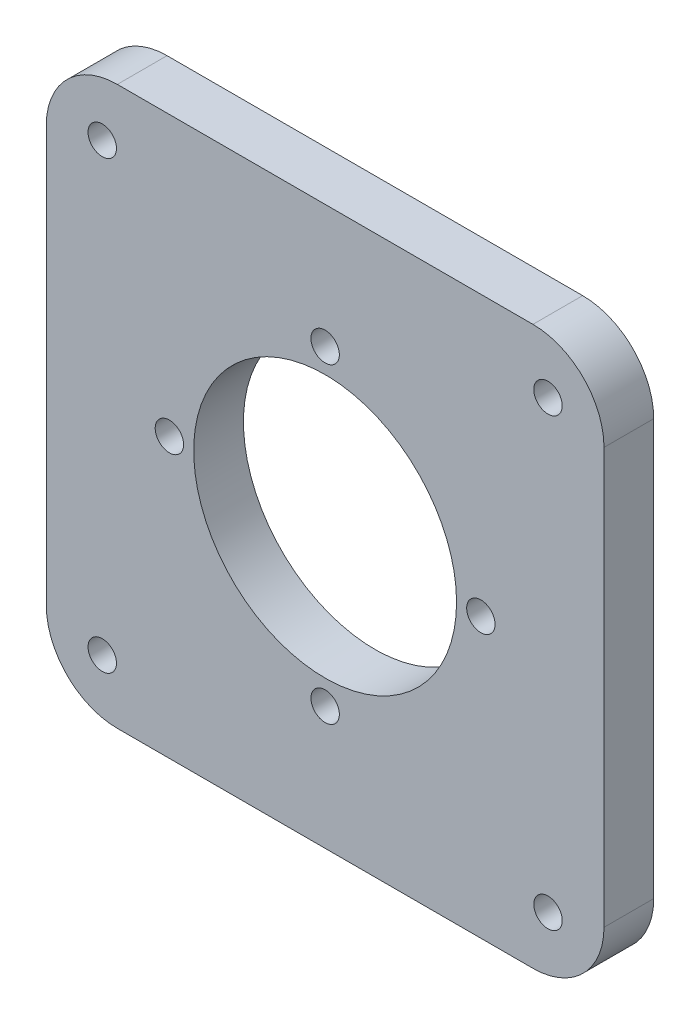
ISO-10303-21;
HEADER;
FILE_DESCRIPTION(('STEP AP214'),'2;1');
FILE_NAME('part.step','',(''),(''),'','','');
FILE_SCHEMA(('AUTOMOTIVE_DESIGN { 1 0 10303 214 1 1 1 1 }'));
ENDSEC;
DATA;
#1=APPLICATION_CONTEXT('core data for automotive mechanical design processes');
#2=APPLICATION_PROTOCOL_DEFINITION('international standard','automotive_design',2000,#1);
#3=PRODUCT_CONTEXT('',#1,'mechanical');
#4=PRODUCT('Part','Part','',(#3));
#5=PRODUCT_RELATED_PRODUCT_CATEGORY('part','',(#4));
#6=PRODUCT_DEFINITION_FORMATION('','',#4);
#7=PRODUCT_DEFINITION_CONTEXT('part definition',#1,'design');
#8=PRODUCT_DEFINITION('design','',#6,#7);
#9=PRODUCT_DEFINITION_SHAPE('','',#8);
#10=(LENGTH_UNIT() NAMED_UNIT(*) SI_UNIT(.MILLI.,.METRE.));
#11=(NAMED_UNIT(*) PLANE_ANGLE_UNIT() SI_UNIT($,.RADIAN.));
#12=(NAMED_UNIT(*) SI_UNIT($,.STERADIAN.) SOLID_ANGLE_UNIT());
#13=UNCERTAINTY_MEASURE_WITH_UNIT(LENGTH_MEASURE(1.E-05),#10,'distance_accuracy_value','');
#14=(GEOMETRIC_REPRESENTATION_CONTEXT(3) GLOBAL_UNCERTAINTY_ASSIGNED_CONTEXT((#13)) GLOBAL_UNIT_ASSIGNED_CONTEXT((#10,
#11,#12)) REPRESENTATION_CONTEXT('',''));
#15=CARTESIAN_POINT('',(0.,0.,0.));
#16=DIRECTION('',(0.,0.,1.));
#17=DIRECTION('',(1.,0.,0.));
#18=AXIS2_PLACEMENT_3D('',#15,#16,#17);
#19=CARTESIAN_POINT('',(39.25,-39.25,3.5));
#20=DIRECTION('',(-1.,0.,0.));
#21=DIRECTION('',(0.,0.,1.));
#22=AXIS2_PLACEMENT_3D('',#19,#20,#21);
#23=PLANE('',#22);
#24=DIRECTION('',(0.,1.,0.));
#25=VECTOR('',#24,1.);
#26=CARTESIAN_POINT('',(39.25,-39.25,3.5));
#27=LINE('',#26,#25);
#28=CARTESIAN_POINT('',(39.25,-29.25,3.5));
#29=VERTEX_POINT('',#28);
#30=CARTESIAN_POINT('',(39.25,29.25,3.5));
#31=VERTEX_POINT('',#30);
#32=EDGE_CURVE('E139',#29,#31,#27,.T.);
#33=ORIENTED_EDGE('',*,*,#32,.F.);
#34=DIRECTION('',(0.,0.,-1.));
#35=VECTOR('',#34,1.);
#36=CARTESIAN_POINT('',(39.25,-29.25,3.5));
#37=LINE('',#36,#35);
#38=CARTESIAN_POINT('',(39.25,-29.25,-3.5));
#39=VERTEX_POINT('',#38);
#40=EDGE_CURVE('E178',#29,#39,#37,.T.);
#41=ORIENTED_EDGE('',*,*,#40,.T.);
#42=DIRECTION('',(0.,1.,0.));
#43=VECTOR('',#42,1.);
#44=CARTESIAN_POINT('',(39.25,-39.25,-3.5));
#45=LINE('',#44,#43);
#46=CARTESIAN_POINT('',(39.25,29.25,-3.5));
#47=VERTEX_POINT('',#46);
#48=EDGE_CURVE('E193',#39,#47,#45,.T.);
#49=ORIENTED_EDGE('',*,*,#48,.T.);
#50=DIRECTION('',(0.,0.,-1.));
#51=VECTOR('',#50,1.);
#52=CARTESIAN_POINT('',(39.25,29.25,3.5));
#53=LINE('',#52,#51);
#54=EDGE_CURVE('E175',#47,#31,#53,.F.);
#55=ORIENTED_EDGE('',*,*,#54,.T.);
#56=EDGE_LOOP('',(#33,#41,#49,#55));
#57=FACE_BOUND('',#56,.T.);
#58=ADVANCED_FACE('F43',(#57),#23,.F.);
#59=CARTESIAN_POINT('',(-39.25,39.25,3.5));
#60=DIRECTION('',(0.,-1.,0.));
#61=DIRECTION('',(0.,0.,-1.));
#62=AXIS2_PLACEMENT_3D('',#59,#60,#61);
#63=PLANE('',#62);
#64=DIRECTION('',(-1.,0.,0.));
#65=VECTOR('',#64,1.);
#66=CARTESIAN_POINT('',(-39.25,39.25,3.5));
#67=LINE('',#66,#65);
#68=CARTESIAN_POINT('',(29.25,39.25,3.5));
#69=VERTEX_POINT('',#68);
#70=CARTESIAN_POINT('',(-29.25,39.25,3.5));
#71=VERTEX_POINT('',#70);
#72=EDGE_CURVE('E144',#69,#71,#67,.T.);
#73=ORIENTED_EDGE('',*,*,#72,.F.);
#74=DIRECTION('',(0.,0.,-1.));
#75=VECTOR('',#74,1.);
#76=CARTESIAN_POINT('',(29.25,39.25,3.5));
#77=LINE('',#76,#75);
#78=CARTESIAN_POINT('',(29.25,39.25,-3.5));
#79=VERTEX_POINT('',#78);
#80=EDGE_CURVE('E11',#69,#79,#77,.T.);
#81=ORIENTED_EDGE('',*,*,#80,.T.);
#82=DIRECTION('',(-1.,0.,0.));
#83=VECTOR('',#82,1.);
#84=CARTESIAN_POINT('',(-39.25,39.25,-3.5));
#85=LINE('',#84,#83);
#86=CARTESIAN_POINT('',(-29.25,39.25,-3.5));
#87=VERTEX_POINT('',#86);
#88=EDGE_CURVE('E146',#79,#87,#85,.T.);
#89=ORIENTED_EDGE('',*,*,#88,.T.);
#90=DIRECTION('',(0.,0.,-1.));
#91=VECTOR('',#90,1.);
#92=CARTESIAN_POINT('',(-29.25,39.25,3.5));
#93=LINE('',#92,#91);
#94=EDGE_CURVE('E52',#87,#71,#93,.F.);
#95=ORIENTED_EDGE('',*,*,#94,.T.);
#96=EDGE_LOOP('',(#73,#81,#89,#95));
#97=FACE_BOUND('',#96,.T.);
#98=ADVANCED_FACE('F199',(#97),#63,.F.);
#99=CARTESIAN_POINT('',(-39.25,-39.25,3.5));
#100=DIRECTION('',(1.,0.,0.));
#101=DIRECTION('',(0.,0.,-1.));
#102=AXIS2_PLACEMENT_3D('',#99,#100,#101);
#103=PLANE('',#102);
#104=DIRECTION('',(0.,-1.,0.));
#105=VECTOR('',#104,1.);
#106=CARTESIAN_POINT('',(-39.25,-39.25,-3.5));
#107=LINE('',#106,#105);
#108=CARTESIAN_POINT('',(-39.25,29.25,-3.5));
#109=VERTEX_POINT('',#108);
#110=CARTESIAN_POINT('',(-39.25,-29.25,-3.5));
#111=VERTEX_POINT('',#110);
#112=EDGE_CURVE('E140',#109,#111,#107,.T.);
#113=ORIENTED_EDGE('',*,*,#112,.T.);
#114=DIRECTION('',(0.,0.,-1.));
#115=VECTOR('',#114,1.);
#116=CARTESIAN_POINT('',(-39.25,-29.25,3.5));
#117=LINE('',#116,#115);
#118=CARTESIAN_POINT('',(-39.25,-29.25,3.5));
#119=VERTEX_POINT('',#118);
#120=EDGE_CURVE('E115',#111,#119,#117,.F.);
#121=ORIENTED_EDGE('',*,*,#120,.T.);
#122=DIRECTION('',(0.,-1.,0.));
#123=VECTOR('',#122,1.);
#124=CARTESIAN_POINT('',(-39.25,-39.25,3.5));
#125=LINE('',#124,#123);
#126=CARTESIAN_POINT('',(-39.25,29.25,3.5));
#127=VERTEX_POINT('',#126);
#128=EDGE_CURVE('E184',#127,#119,#125,.T.);
#129=ORIENTED_EDGE('',*,*,#128,.F.);
#130=DIRECTION('',(0.,0.,-1.));
#131=VECTOR('',#130,1.);
#132=CARTESIAN_POINT('',(-39.25,29.25,3.5));
#133=LINE('',#132,#131);
#134=EDGE_CURVE('E121',#127,#109,#133,.T.);
#135=ORIENTED_EDGE('',*,*,#134,.T.);
#136=EDGE_LOOP('',(#113,#121,#129,#135));
#137=FACE_BOUND('',#136,.T.);
#138=ADVANCED_FACE('F206',(#137),#103,.F.);
#139=CARTESIAN_POINT('',(-39.25,-39.25,3.5));
#140=DIRECTION('',(0.,1.,0.));
#141=DIRECTION('',(0.,0.,1.));
#142=AXIS2_PLACEMENT_3D('',#139,#140,#141);
#143=PLANE('',#142);
#144=DIRECTION('',(1.,0.,0.));
#145=VECTOR('',#144,1.);
#146=CARTESIAN_POINT('',(-39.25,-39.25,3.5));
#147=LINE('',#146,#145);
#148=CARTESIAN_POINT('',(-29.25,-39.25,3.5));
#149=VERTEX_POINT('',#148);
#150=CARTESIAN_POINT('',(29.25,-39.25,3.5));
#151=VERTEX_POINT('',#150);
#152=EDGE_CURVE('E131',#149,#151,#147,.T.);
#153=ORIENTED_EDGE('',*,*,#152,.F.);
#154=DIRECTION('',(0.,0.,-1.));
#155=VECTOR('',#154,1.);
#156=CARTESIAN_POINT('',(-29.25,-39.25,3.5));
#157=LINE('',#156,#155);
#158=CARTESIAN_POINT('',(-29.25,-39.25,-3.5));
#159=VERTEX_POINT('',#158);
#160=EDGE_CURVE('E114',#149,#159,#157,.T.);
#161=ORIENTED_EDGE('',*,*,#160,.T.);
#162=DIRECTION('',(1.,0.,0.));
#163=VECTOR('',#162,1.);
#164=CARTESIAN_POINT('',(-39.25,-39.25,-3.5));
#165=LINE('',#164,#163);
#166=CARTESIAN_POINT('',(29.25,-39.25,-3.5));
#167=VERTEX_POINT('',#166);
#168=EDGE_CURVE('E128',#159,#167,#165,.T.);
#169=ORIENTED_EDGE('',*,*,#168,.T.);
#170=DIRECTION('',(0.,0.,-1.));
#171=VECTOR('',#170,1.);
#172=CARTESIAN_POINT('',(29.25,-39.25,3.5));
#173=LINE('',#172,#171);
#174=EDGE_CURVE('E134',#167,#151,#173,.F.);
#175=ORIENTED_EDGE('',*,*,#174,.T.);
#176=EDGE_LOOP('',(#153,#161,#169,#175));
#177=FACE_BOUND('',#176,.T.);
#178=ADVANCED_FACE('F127',(#177),#143,.F.);
#179=CARTESIAN_POINT('',(0.,0.,3.5));
#180=DIRECTION('',(0.,0.,-1.));
#181=DIRECTION('',(-1.,0.,0.));
#182=AXIS2_PLACEMENT_3D('',#179,#180,#181);
#183=PLANE('',#182);
#184=CARTESIAN_POINT('',(0.,21.920310216783,3.5));
#185=DIRECTION('',(0.,0.,1.));
#186=DIRECTION('',(1.,0.,0.));
#187=AXIS2_PLACEMENT_3D('',#184,#185,#186);
#188=CIRCLE('',#187,2.00000000000001);
#189=CARTESIAN_POINT('',(2.00000000000001,21.920310216783,3.5));
#190=VERTEX_POINT('',#189);
#191=EDGE_CURVE('E342',#190,#190,#188,.T.);
#192=ORIENTED_EDGE('',*,*,#191,.F.);
#193=EDGE_LOOP('',(#192));
#194=FACE_BOUND('',#193,.T.);
#195=CARTESIAN_POINT('',(-21.920310216783,0.,3.5));
#196=DIRECTION('',(0.,0.,1.));
#197=DIRECTION('',(1.,0.,0.));
#198=AXIS2_PLACEMENT_3D('',#195,#196,#197);
#199=CIRCLE('',#198,2.00000000000001);
#200=CARTESIAN_POINT('',(-19.920310216783,0.,3.5));
#201=VERTEX_POINT('',#200);
#202=EDGE_CURVE('E338',#201,#201,#199,.T.);
#203=ORIENTED_EDGE('',*,*,#202,.F.);
#204=EDGE_LOOP('',(#203));
#205=FACE_BOUND('',#204,.T.);
#206=CARTESIAN_POINT('',(0.,-21.920310216783,3.5));
#207=DIRECTION('',(0.,0.,1.));
#208=DIRECTION('',(1.,0.,0.));
#209=AXIS2_PLACEMENT_3D('',#206,#207,#208);
#210=CIRCLE('',#209,2.00000000000001);
#211=CARTESIAN_POINT('',(2.00000000000001,-21.920310216783,3.5));
#212=VERTEX_POINT('',#211);
#213=EDGE_CURVE('E332',#212,#212,#210,.T.);
#214=ORIENTED_EDGE('',*,*,#213,.F.);
#215=EDGE_LOOP('',(#214));
#216=FACE_BOUND('',#215,.T.);
#217=CARTESIAN_POINT('',(21.920310216783,0.,3.5));
#218=DIRECTION('',(0.,0.,1.));
#219=DIRECTION('',(1.,0.,0.));
#220=AXIS2_PLACEMENT_3D('',#217,#218,#219);
#221=CIRCLE('',#220,2.00000000000001);
#222=CARTESIAN_POINT('',(23.920310216783,0.,3.5));
#223=VERTEX_POINT('',#222);
#224=EDGE_CURVE('E326',#223,#223,#221,.T.);
#225=ORIENTED_EDGE('',*,*,#224,.F.);
#226=EDGE_LOOP('',(#225));
#227=FACE_BOUND('',#226,.T.);
#228=CARTESIAN_POINT('',(0.,0.,3.5));
#229=DIRECTION('',(0.,0.,1.));
#230=DIRECTION('',(1.,0.,0.));
#231=AXIS2_PLACEMENT_3D('',#228,#229,#230);
#232=CIRCLE('',#231,18.5);
#233=CARTESIAN_POINT('',(18.5,0.,3.5));
#234=VERTEX_POINT('',#233);
#235=EDGE_CURVE('E318',#234,#234,#232,.T.);
#236=ORIENTED_EDGE('',*,*,#235,.F.);
#237=EDGE_LOOP('',(#236));
#238=FACE_BOUND('',#237,.T.);
#239=CARTESIAN_POINT('',(-31.3713203435598,-31.3713203435595,3.5));
#240=DIRECTION('',(0.,0.,1.));
#241=DIRECTION('',(-1.,0.,0.));
#242=AXIS2_PLACEMENT_3D('',#239,#240,#241);
#243=CIRCLE('',#242,2.);
#244=CARTESIAN_POINT('',(-33.3713203435598,-31.3713203435595,3.5));
#245=VERTEX_POINT('',#244);
#246=EDGE_CURVE('E299',#245,#245,#243,.T.);
#247=ORIENTED_EDGE('',*,*,#246,.F.);
#248=EDGE_LOOP('',(#247));
#249=FACE_BOUND('',#248,.T.);
#250=CARTESIAN_POINT('',(31.3713203435598,31.3713203435595,3.5));
#251=DIRECTION('',(0.,0.,1.));
#252=DIRECTION('',(-1.,0.,0.));
#253=AXIS2_PLACEMENT_3D('',#250,#251,#252);
#254=CIRCLE('',#253,2.);
#255=CARTESIAN_POINT('',(29.3713203435598,31.3713203435595,3.5));
#256=VERTEX_POINT('',#255);
#257=EDGE_CURVE('E303',#256,#256,#254,.T.);
#258=ORIENTED_EDGE('',*,*,#257,.F.);
#259=EDGE_LOOP('',(#258));
#260=FACE_BOUND('',#259,.T.);
#261=CARTESIAN_POINT('',(31.3713203435598,-31.3713203435595,3.5));
#262=DIRECTION('',(0.,0.,1.));
#263=DIRECTION('',(1.,0.,0.));
#264=AXIS2_PLACEMENT_3D('',#261,#262,#263);
#265=CIRCLE('',#264,2.);
#266=CARTESIAN_POINT('',(33.3713203435598,-31.3713203435595,3.5));
#267=VERTEX_POINT('',#266);
#268=EDGE_CURVE('E304',#267,#267,#265,.T.);
#269=ORIENTED_EDGE('',*,*,#268,.F.);
#270=EDGE_LOOP('',(#269));
#271=FACE_BOUND('',#270,.T.);
#272=CARTESIAN_POINT('',(-31.3713203435598,31.3713203435595,3.5));
#273=DIRECTION('',(0.,0.,1.));
#274=DIRECTION('',(1.,0.,0.));
#275=AXIS2_PLACEMENT_3D('',#272,#273,#274);
#276=CIRCLE('',#275,2.);
#277=CARTESIAN_POINT('',(-29.3713203435598,31.3713203435595,3.5));
#278=VERTEX_POINT('',#277);
#279=EDGE_CURVE('E295',#278,#278,#276,.T.);
#280=ORIENTED_EDGE('',*,*,#279,.F.);
#281=EDGE_LOOP('',(#280));
#282=FACE_BOUND('',#281,.T.);
#283=ORIENTED_EDGE('',*,*,#128,.T.);
#284=CARTESIAN_POINT('',(-29.25,-29.25,3.5));
#285=DIRECTION('',(0.,0.,-1.));
#286=DIRECTION('',(-1.,0.,0.));
#287=AXIS2_PLACEMENT_3D('',#284,#285,#286);
#288=CIRCLE('',#287,10.);
#289=EDGE_CURVE('E172',#119,#149,#288,.F.);
#290=ORIENTED_EDGE('',*,*,#289,.T.);
#291=ORIENTED_EDGE('',*,*,#152,.T.);
#292=CARTESIAN_POINT('',(29.25,-29.25,3.5));
#293=DIRECTION('',(0.,0.,-1.));
#294=DIRECTION('',(-1.,0.,0.));
#295=AXIS2_PLACEMENT_3D('',#292,#293,#294);
#296=CIRCLE('',#295,10.);
#297=EDGE_CURVE('E169',#151,#29,#296,.F.);
#298=ORIENTED_EDGE('',*,*,#297,.T.);
#299=ORIENTED_EDGE('',*,*,#32,.T.);
#300=CARTESIAN_POINT('',(29.25,29.25,3.5));
#301=DIRECTION('',(0.,0.,-1.));
#302=DIRECTION('',(-1.,0.,0.));
#303=AXIS2_PLACEMENT_3D('',#300,#301,#302);
#304=CIRCLE('',#303,10.);
#305=EDGE_CURVE('E65',#31,#69,#304,.F.);
#306=ORIENTED_EDGE('',*,*,#305,.T.);
#307=ORIENTED_EDGE('',*,*,#72,.T.);
#308=CARTESIAN_POINT('',(-29.25,29.25,3.5));
#309=DIRECTION('',(0.,0.,-1.));
#310=DIRECTION('',(-1.,0.,0.));
#311=AXIS2_PLACEMENT_3D('',#308,#309,#310);
#312=CIRCLE('',#311,10.);
#313=EDGE_CURVE('E164',#71,#127,#312,.F.);
#314=ORIENTED_EDGE('',*,*,#313,.T.);
#315=EDGE_LOOP('',(#283,#290,#291,#298,#299,#306,#307,#314));
#316=FACE_BOUND('',#315,.T.);
#317=ADVANCED_FACE('F204',(#194,#205,#216,#227,#238,#249,#260,#271,#282,#316),#183,.F.);
#318=CARTESIAN_POINT('',(0.,0.,-3.5));
#319=DIRECTION('',(0.,0.,-1.));
#320=DIRECTION('',(-1.,0.,0.));
#321=AXIS2_PLACEMENT_3D('',#318,#319,#320);
#322=PLANE('',#321);
#323=CARTESIAN_POINT('',(0.,21.920310216783,-3.5));
#324=DIRECTION('',(0.,0.,1.));
#325=DIRECTION('',(1.,0.,0.));
#326=AXIS2_PLACEMENT_3D('',#323,#324,#325);
#327=CIRCLE('',#326,2.00000000000001);
#328=CARTESIAN_POINT('',(2.00000000000001,21.920310216783,-3.5));
#329=VERTEX_POINT('',#328);
#330=EDGE_CURVE('E264',#329,#329,#327,.T.);
#331=ORIENTED_EDGE('',*,*,#330,.T.);
#332=EDGE_LOOP('',(#331));
#333=FACE_BOUND('',#332,.T.);
#334=CARTESIAN_POINT('',(-21.920310216783,0.,-3.5));
#335=DIRECTION('',(0.,0.,1.));
#336=DIRECTION('',(1.,0.,0.));
#337=AXIS2_PLACEMENT_3D('',#334,#335,#336);
#338=CIRCLE('',#337,2.00000000000001);
#339=CARTESIAN_POINT('',(-19.920310216783,0.,-3.5));
#340=VERTEX_POINT('',#339);
#341=EDGE_CURVE('E268',#340,#340,#338,.T.);
#342=ORIENTED_EDGE('',*,*,#341,.T.);
#343=EDGE_LOOP('',(#342));
#344=FACE_BOUND('',#343,.T.);
#345=CARTESIAN_POINT('',(0.,-21.920310216783,-3.5));
#346=DIRECTION('',(0.,0.,1.));
#347=DIRECTION('',(1.,0.,0.));
#348=AXIS2_PLACEMENT_3D('',#345,#346,#347);
#349=CIRCLE('',#348,2.00000000000001);
#350=CARTESIAN_POINT('',(2.00000000000001,-21.920310216783,-3.5));
#351=VERTEX_POINT('',#350);
#352=EDGE_CURVE('E272',#351,#351,#349,.T.);
#353=ORIENTED_EDGE('',*,*,#352,.T.);
#354=EDGE_LOOP('',(#353));
#355=FACE_BOUND('',#354,.T.);
#356=CARTESIAN_POINT('',(21.920310216783,0.,-3.5));
#357=DIRECTION('',(0.,0.,1.));
#358=DIRECTION('',(1.,0.,0.));
#359=AXIS2_PLACEMENT_3D('',#356,#357,#358);
#360=CIRCLE('',#359,2.00000000000001);
#361=CARTESIAN_POINT('',(23.920310216783,0.,-3.5));
#362=VERTEX_POINT('',#361);
#363=EDGE_CURVE('E276',#362,#362,#360,.T.);
#364=ORIENTED_EDGE('',*,*,#363,.T.);
#365=EDGE_LOOP('',(#364));
#366=FACE_BOUND('',#365,.T.);
#367=CARTESIAN_POINT('',(0.,0.,-3.5));
#368=DIRECTION('',(0.,0.,1.));
#369=DIRECTION('',(1.,0.,0.));
#370=AXIS2_PLACEMENT_3D('',#367,#368,#369);
#371=CIRCLE('',#370,18.5);
#372=CARTESIAN_POINT('',(18.5,0.,-3.5));
#373=VERTEX_POINT('',#372);
#374=EDGE_CURVE('E280',#373,#373,#371,.T.);
#375=ORIENTED_EDGE('',*,*,#374,.T.);
#376=EDGE_LOOP('',(#375));
#377=FACE_BOUND('',#376,.T.);
#378=CARTESIAN_POINT('',(-31.3713203435598,-31.3713203435595,-3.5));
#379=DIRECTION('',(0.,0.,1.));
#380=DIRECTION('',(-1.,0.,0.));
#381=AXIS2_PLACEMENT_3D('',#378,#379,#380);
#382=CIRCLE('',#381,2.);
#383=CARTESIAN_POINT('',(-33.3713203435598,-31.3713203435595,-3.5));
#384=VERTEX_POINT('',#383);
#385=EDGE_CURVE('E284',#384,#384,#382,.T.);
#386=ORIENTED_EDGE('',*,*,#385,.T.);
#387=EDGE_LOOP('',(#386));
#388=FACE_BOUND('',#387,.T.);
#389=CARTESIAN_POINT('',(31.3713203435598,31.3713203435595,-3.5));
#390=DIRECTION('',(0.,0.,1.));
#391=DIRECTION('',(-1.,0.,0.));
#392=AXIS2_PLACEMENT_3D('',#389,#390,#391);
#393=CIRCLE('',#392,2.);
#394=CARTESIAN_POINT('',(29.3713203435598,31.3713203435595,-3.5));
#395=VERTEX_POINT('',#394);
#396=EDGE_CURVE('E288',#395,#395,#393,.T.);
#397=ORIENTED_EDGE('',*,*,#396,.T.);
#398=EDGE_LOOP('',(#397));
#399=FACE_BOUND('',#398,.T.);
#400=CARTESIAN_POINT('',(31.3713203435598,-31.3713203435595,-3.5));
#401=DIRECTION('',(0.,0.,1.));
#402=DIRECTION('',(1.,0.,0.));
#403=AXIS2_PLACEMENT_3D('',#400,#401,#402);
#404=CIRCLE('',#403,2.);
#405=CARTESIAN_POINT('',(33.3713203435598,-31.3713203435595,-3.5));
#406=VERTEX_POINT('',#405);
#407=EDGE_CURVE('E292',#406,#406,#404,.T.);
#408=ORIENTED_EDGE('',*,*,#407,.T.);
#409=EDGE_LOOP('',(#408));
#410=FACE_BOUND('',#409,.T.);
#411=CARTESIAN_POINT('',(-31.3713203435598,31.3713203435595,-3.5));
#412=DIRECTION('',(0.,0.,1.));
#413=DIRECTION('',(1.,0.,0.));
#414=AXIS2_PLACEMENT_3D('',#411,#412,#413);
#415=CIRCLE('',#414,2.);
#416=CARTESIAN_POINT('',(-29.3713203435598,31.3713203435595,-3.5));
#417=VERTEX_POINT('',#416);
#418=EDGE_CURVE('E196',#417,#417,#415,.T.);
#419=ORIENTED_EDGE('',*,*,#418,.T.);
#420=EDGE_LOOP('',(#419));
#421=FACE_BOUND('',#420,.T.);
#422=ORIENTED_EDGE('',*,*,#168,.F.);
#423=CARTESIAN_POINT('',(-29.25,-29.25,-3.5));
#424=DIRECTION('',(0.,0.,-1.));
#425=DIRECTION('',(-1.,0.,0.));
#426=AXIS2_PLACEMENT_3D('',#423,#424,#425);
#427=CIRCLE('',#426,10.);
#428=EDGE_CURVE('E110',#159,#111,#427,.T.);
#429=ORIENTED_EDGE('',*,*,#428,.T.);
#430=ORIENTED_EDGE('',*,*,#112,.F.);
#431=CARTESIAN_POINT('',(-29.25,29.25,-3.5));
#432=DIRECTION('',(0.,0.,-1.));
#433=DIRECTION('',(-1.,0.,0.));
#434=AXIS2_PLACEMENT_3D('',#431,#432,#433);
#435=CIRCLE('',#434,10.);
#436=EDGE_CURVE('E133',#109,#87,#435,.T.);
#437=ORIENTED_EDGE('',*,*,#436,.T.);
#438=ORIENTED_EDGE('',*,*,#88,.F.);
#439=CARTESIAN_POINT('',(29.25,29.25,-3.5));
#440=DIRECTION('',(0.,0.,-1.));
#441=DIRECTION('',(-1.,0.,0.));
#442=AXIS2_PLACEMENT_3D('',#439,#440,#441);
#443=CIRCLE('',#442,10.);
#444=EDGE_CURVE('E154',#79,#47,#443,.T.);
#445=ORIENTED_EDGE('',*,*,#444,.T.);
#446=ORIENTED_EDGE('',*,*,#48,.F.);
#447=CARTESIAN_POINT('',(29.25,-29.25,-3.5));
#448=DIRECTION('',(0.,0.,-1.));
#449=DIRECTION('',(-1.,0.,0.));
#450=AXIS2_PLACEMENT_3D('',#447,#448,#449);
#451=CIRCLE('',#450,10.);
#452=EDGE_CURVE('E122',#39,#167,#451,.T.);
#453=ORIENTED_EDGE('',*,*,#452,.T.);
#454=EDGE_LOOP('',(#422,#429,#430,#437,#438,#445,#446,#453));
#455=FACE_BOUND('',#454,.T.);
#456=ADVANCED_FACE('F136',(#333,#344,#355,#366,#377,#388,#399,#410,#421,#455),#322,.T.);
#457=CARTESIAN_POINT('',(-29.25,-29.25,3.5));
#458=DIRECTION('',(0.,0.,-1.));
#459=DIRECTION('',(-1.,0.,0.));
#460=AXIS2_PLACEMENT_3D('',#457,#458,#459);
#461=CYLINDRICAL_SURFACE('',#460,10.);
#462=ORIENTED_EDGE('',*,*,#289,.F.);
#463=ORIENTED_EDGE('',*,*,#120,.F.);
#464=ORIENTED_EDGE('',*,*,#428,.F.);
#465=ORIENTED_EDGE('',*,*,#160,.F.);
#466=EDGE_LOOP('',(#462,#463,#464,#465));
#467=FACE_BOUND('',#466,.T.);
#468=ADVANCED_FACE('F113',(#467),#461,.T.);
#469=CARTESIAN_POINT('',(29.25,-29.25,3.5));
#470=DIRECTION('',(0.,0.,-1.));
#471=DIRECTION('',(-1.,0.,0.));
#472=AXIS2_PLACEMENT_3D('',#469,#470,#471);
#473=CYLINDRICAL_SURFACE('',#472,10.);
#474=ORIENTED_EDGE('',*,*,#297,.F.);
#475=ORIENTED_EDGE('',*,*,#174,.F.);
#476=ORIENTED_EDGE('',*,*,#452,.F.);
#477=ORIENTED_EDGE('',*,*,#40,.F.);
#478=EDGE_LOOP('',(#474,#475,#476,#477));
#479=FACE_BOUND('',#478,.T.);
#480=ADVANCED_FACE('F224',(#479),#473,.T.);
#481=CARTESIAN_POINT('',(29.25,29.25,3.5));
#482=DIRECTION('',(0.,0.,-1.));
#483=DIRECTION('',(-1.,0.,0.));
#484=AXIS2_PLACEMENT_3D('',#481,#482,#483);
#485=CYLINDRICAL_SURFACE('',#484,10.);
#486=ORIENTED_EDGE('',*,*,#305,.F.);
#487=ORIENTED_EDGE('',*,*,#54,.F.);
#488=ORIENTED_EDGE('',*,*,#444,.F.);
#489=ORIENTED_EDGE('',*,*,#80,.F.);
#490=EDGE_LOOP('',(#486,#487,#488,#489));
#491=FACE_BOUND('',#490,.T.);
#492=ADVANCED_FACE('F226',(#491),#485,.T.);
#493=CARTESIAN_POINT('',(-29.25,29.25,3.5));
#494=DIRECTION('',(0.,0.,-1.));
#495=DIRECTION('',(-1.,0.,0.));
#496=AXIS2_PLACEMENT_3D('',#493,#494,#495);
#497=CYLINDRICAL_SURFACE('',#496,10.);
#498=ORIENTED_EDGE('',*,*,#313,.F.);
#499=ORIENTED_EDGE('',*,*,#94,.F.);
#500=ORIENTED_EDGE('',*,*,#436,.F.);
#501=ORIENTED_EDGE('',*,*,#134,.F.);
#502=EDGE_LOOP('',(#498,#499,#500,#501));
#503=FACE_BOUND('',#502,.T.);
#504=ADVANCED_FACE('F45',(#503),#497,.T.);
#505=CARTESIAN_POINT('',(-31.3713203435598,31.3713203435595,-3.5));
#506=DIRECTION('',(0.,0.,1.));
#507=DIRECTION('',(1.,0.,0.));
#508=AXIS2_PLACEMENT_3D('',#505,#506,#507);
#509=CYLINDRICAL_SURFACE('',#508,2.);
#510=ORIENTED_EDGE('',*,*,#418,.F.);
#511=EDGE_LOOP('',(#510));
#512=FACE_BOUND('',#511,.T.);
#513=ORIENTED_EDGE('',*,*,#279,.T.);
#514=EDGE_LOOP('',(#513));
#515=FACE_BOUND('',#514,.T.);
#516=ADVANCED_FACE('F233',(#512,#515),#509,.F.);
#517=CARTESIAN_POINT('',(31.3713203435598,-31.3713203435595,-3.5));
#518=DIRECTION('',(0.,0.,1.));
#519=DIRECTION('',(1.,0.,0.));
#520=AXIS2_PLACEMENT_3D('',#517,#518,#519);
#521=CYLINDRICAL_SURFACE('',#520,2.);
#522=ORIENTED_EDGE('',*,*,#407,.F.);
#523=EDGE_LOOP('',(#522));
#524=FACE_BOUND('',#523,.T.);
#525=ORIENTED_EDGE('',*,*,#268,.T.);
#526=EDGE_LOOP('',(#525));
#527=FACE_BOUND('',#526,.T.);
#528=ADVANCED_FACE('F240',(#524,#527),#521,.F.);
#529=CARTESIAN_POINT('',(31.3713203435598,31.3713203435595,-3.5));
#530=DIRECTION('',(0.,0.,1.));
#531=DIRECTION('',(1.,0.,0.));
#532=AXIS2_PLACEMENT_3D('',#529,#530,#531);
#533=CYLINDRICAL_SURFACE('',#532,2.);
#534=ORIENTED_EDGE('',*,*,#396,.F.);
#535=EDGE_LOOP('',(#534));
#536=FACE_BOUND('',#535,.T.);
#537=ORIENTED_EDGE('',*,*,#257,.T.);
#538=EDGE_LOOP('',(#537));
#539=FACE_BOUND('',#538,.T.);
#540=ADVANCED_FACE('F246',(#536,#539),#533,.F.);
#541=CARTESIAN_POINT('',(-31.3713203435598,-31.3713203435595,-3.5));
#542=DIRECTION('',(0.,0.,1.));
#543=DIRECTION('',(1.,0.,0.));
#544=AXIS2_PLACEMENT_3D('',#541,#542,#543);
#545=CYLINDRICAL_SURFACE('',#544,2.);
#546=ORIENTED_EDGE('',*,*,#385,.F.);
#547=EDGE_LOOP('',(#546));
#548=FACE_BOUND('',#547,.T.);
#549=ORIENTED_EDGE('',*,*,#246,.T.);
#550=EDGE_LOOP('',(#549));
#551=FACE_BOUND('',#550,.T.);
#552=ADVANCED_FACE('F369',(#548,#551),#545,.F.);
#553=CARTESIAN_POINT('',(0.,0.,-3.5));
#554=DIRECTION('',(0.,0.,1.));
#555=DIRECTION('',(1.,0.,0.));
#556=AXIS2_PLACEMENT_3D('',#553,#554,#555);
#557=CYLINDRICAL_SURFACE('',#556,18.5);
#558=ORIENTED_EDGE('',*,*,#374,.F.);
#559=EDGE_LOOP('',(#558));
#560=FACE_BOUND('',#559,.T.);
#561=ORIENTED_EDGE('',*,*,#235,.T.);
#562=EDGE_LOOP('',(#561));
#563=FACE_BOUND('',#562,.T.);
#564=ADVANCED_FACE('F374',(#560,#563),#557,.F.);
#565=CARTESIAN_POINT('',(21.920310216783,0.,-3.5));
#566=DIRECTION('',(0.,0.,1.));
#567=DIRECTION('',(1.,0.,0.));
#568=AXIS2_PLACEMENT_3D('',#565,#566,#567);
#569=CYLINDRICAL_SURFACE('',#568,2.00000000000001);
#570=ORIENTED_EDGE('',*,*,#363,.F.);
#571=EDGE_LOOP('',(#570));
#572=FACE_BOUND('',#571,.T.);
#573=ORIENTED_EDGE('',*,*,#224,.T.);
#574=EDGE_LOOP('',(#573));
#575=FACE_BOUND('',#574,.T.);
#576=ADVANCED_FACE('F379',(#572,#575),#569,.F.);
#577=CARTESIAN_POINT('',(0.,-21.920310216783,-3.5));
#578=DIRECTION('',(0.,0.,1.));
#579=DIRECTION('',(1.,0.,0.));
#580=AXIS2_PLACEMENT_3D('',#577,#578,#579);
#581=CYLINDRICAL_SURFACE('',#580,2.00000000000001);
#582=ORIENTED_EDGE('',*,*,#352,.F.);
#583=EDGE_LOOP('',(#582));
#584=FACE_BOUND('',#583,.T.);
#585=ORIENTED_EDGE('',*,*,#213,.T.);
#586=EDGE_LOOP('',(#585));
#587=FACE_BOUND('',#586,.T.);
#588=ADVANCED_FACE('F386',(#584,#587),#581,.F.);
#589=CARTESIAN_POINT('',(-21.920310216783,0.,-3.5));
#590=DIRECTION('',(0.,0.,1.));
#591=DIRECTION('',(1.,0.,0.));
#592=AXIS2_PLACEMENT_3D('',#589,#590,#591);
#593=CYLINDRICAL_SURFACE('',#592,2.00000000000001);
#594=ORIENTED_EDGE('',*,*,#341,.F.);
#595=EDGE_LOOP('',(#594));
#596=FACE_BOUND('',#595,.T.);
#597=ORIENTED_EDGE('',*,*,#202,.T.);
#598=EDGE_LOOP('',(#597));
#599=FACE_BOUND('',#598,.T.);
#600=ADVANCED_FACE('F390',(#596,#599),#593,.F.);
#601=CARTESIAN_POINT('',(0.,21.920310216783,-3.5));
#602=DIRECTION('',(0.,0.,1.));
#603=DIRECTION('',(1.,0.,0.));
#604=AXIS2_PLACEMENT_3D('',#601,#602,#603);
#605=CYLINDRICAL_SURFACE('',#604,2.00000000000001);
#606=ORIENTED_EDGE('',*,*,#330,.F.);
#607=EDGE_LOOP('',(#606));
#608=FACE_BOUND('',#607,.T.);
#609=ORIENTED_EDGE('',*,*,#191,.T.);
#610=EDGE_LOOP('',(#609));
#611=FACE_BOUND('',#610,.T.);
#612=ADVANCED_FACE('F349',(#608,#611),#605,.F.);
#613=CLOSED_SHELL('',(#58,#98,#138,#178,#317,#456,#468,#480,#492,#504,#516,#528,#540,#552,#564,
#576,#588,#600,#612));
#614=MANIFOLD_SOLID_BREP('B2',#613);
#615=ADVANCED_BREP_SHAPE_REPRESENTATION('',(#18,#614),#14);
#616=SHAPE_DEFINITION_REPRESENTATION(#9,#615);
ENDSEC;
END-ISO-10303-21;
